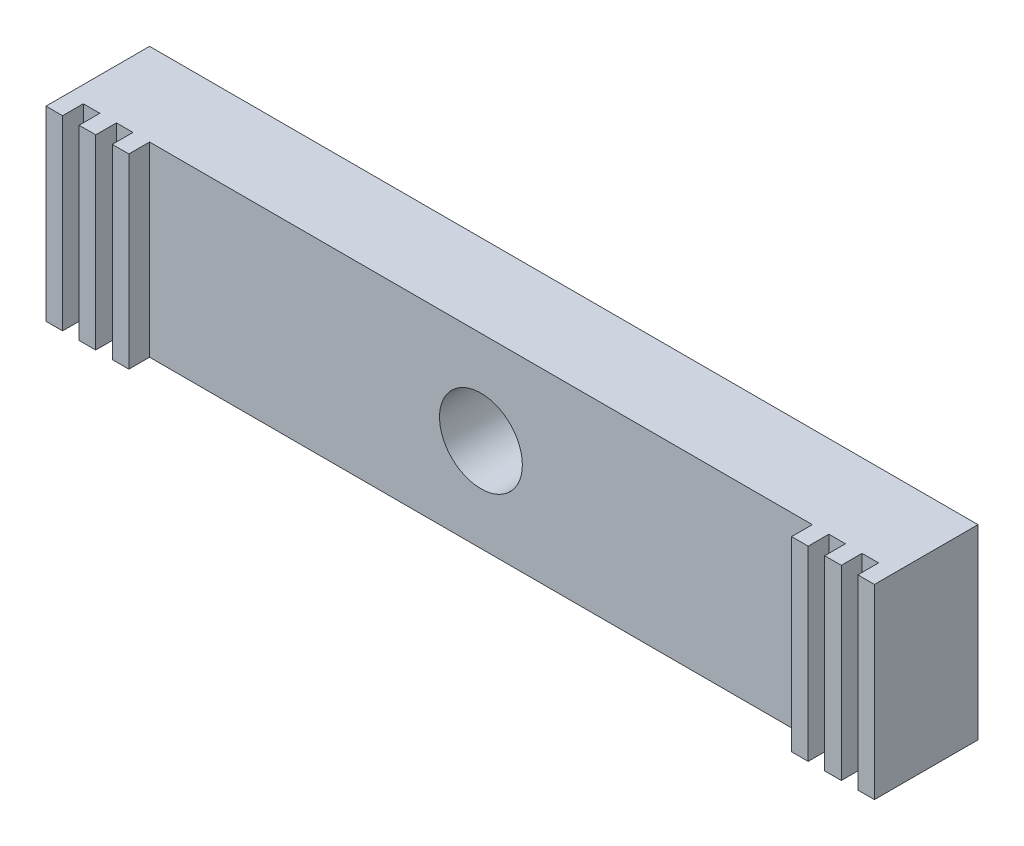
ISO-10303-21;
HEADER;
FILE_DESCRIPTION(('STEP AP214'),'2;1');
FILE_NAME('part.step','',(''),(''),'','','');
FILE_SCHEMA(('AUTOMOTIVE_DESIGN { 1 0 10303 214 1 1 1 1 }'));
ENDSEC;
DATA;
#1=APPLICATION_CONTEXT('core data for automotive mechanical design processes');
#2=APPLICATION_PROTOCOL_DEFINITION('international standard','automotive_design',2000,#1);
#3=PRODUCT_CONTEXT('',#1,'mechanical');
#4=PRODUCT('Part','Part','',(#3));
#5=PRODUCT_RELATED_PRODUCT_CATEGORY('part','',(#4));
#6=PRODUCT_DEFINITION_FORMATION('','',#4);
#7=PRODUCT_DEFINITION_CONTEXT('part definition',#1,'design');
#8=PRODUCT_DEFINITION('design','',#6,#7);
#9=PRODUCT_DEFINITION_SHAPE('','',#8);
#10=(LENGTH_UNIT() NAMED_UNIT(*) SI_UNIT(.MILLI.,.METRE.));
#11=(NAMED_UNIT(*) PLANE_ANGLE_UNIT() SI_UNIT($,.RADIAN.));
#12=(NAMED_UNIT(*) SI_UNIT($,.STERADIAN.) SOLID_ANGLE_UNIT());
#13=UNCERTAINTY_MEASURE_WITH_UNIT(LENGTH_MEASURE(1.E-05),#10,'distance_accuracy_value','');
#14=(GEOMETRIC_REPRESENTATION_CONTEXT(3) GLOBAL_UNCERTAINTY_ASSIGNED_CONTEXT((#13)) GLOBAL_UNIT_ASSIGNED_CONTEXT((#10,
#11,#12)) REPRESENTATION_CONTEXT('',''));
#15=CARTESIAN_POINT('',(0.,0.,0.));
#16=DIRECTION('',(0.,0.,1.));
#17=DIRECTION('',(1.,0.,0.));
#18=AXIS2_PLACEMENT_3D('',#15,#16,#17);
#19=CARTESIAN_POINT('',(0.,0.,4.));
#20=DIRECTION('',(0.,0.,1.));
#21=DIRECTION('',(1.,0.,0.));
#22=AXIS2_PLACEMENT_3D('',#19,#20,#21);
#23=PLANE('',#22);
#24=DIRECTION('',(1.,0.,0.));
#25=VECTOR('',#24,1.);
#26=CARTESIAN_POINT('',(-20.,-4.5,4.));
#27=LINE('',#26,#25);
#28=CARTESIAN_POINT('',(18.4,-4.5,4.));
#29=VERTEX_POINT('',#28);
#30=CARTESIAN_POINT('',(19.2,-4.5,4.));
#31=VERTEX_POINT('',#30);
#32=EDGE_CURVE('E54',#29,#31,#27,.T.);
#33=ORIENTED_EDGE('',*,*,#32,.T.);
#34=DIRECTION('',(0.,-1.,0.));
#35=VECTOR('',#34,1.);
#36=CARTESIAN_POINT('',(19.2,4.5,4.));
#37=LINE('',#36,#35);
#38=CARTESIAN_POINT('',(19.2,4.5,4.));
#39=VERTEX_POINT('',#38);
#40=EDGE_CURVE('E211',#39,#31,#37,.T.);
#41=ORIENTED_EDGE('',*,*,#40,.F.);
#42=DIRECTION('',(-1.,0.,0.));
#43=VECTOR('',#42,1.);
#44=CARTESIAN_POINT('',(-20.,4.5,4.));
#45=LINE('',#44,#43);
#46=CARTESIAN_POINT('',(18.4,4.5,4.));
#47=VERTEX_POINT('',#46);
#48=EDGE_CURVE('E199',#39,#47,#45,.T.);
#49=ORIENTED_EDGE('',*,*,#48,.T.);
#50=DIRECTION('',(0.,1.,0.));
#51=VECTOR('',#50,1.);
#52=CARTESIAN_POINT('',(18.4,4.5,4.));
#53=LINE('',#52,#51);
#54=EDGE_CURVE('E59',#29,#47,#53,.T.);
#55=ORIENTED_EDGE('',*,*,#54,.F.);
#56=EDGE_LOOP('',(#33,#41,#49,#55));
#57=FACE_BOUND('',#56,.T.);
#58=ADVANCED_FACE('F39',(#57),#23,.T.);
#59=CARTESIAN_POINT('',(16.8,-4.5,4.));
#60=VERTEX_POINT('',#59);
#61=CARTESIAN_POINT('',(17.6,-4.5,4.));
#62=VERTEX_POINT('',#61);
#63=EDGE_CURVE('E426',#60,#62,#27,.T.);
#64=ORIENTED_EDGE('',*,*,#63,.T.);
#65=DIRECTION('',(0.,-1.,0.));
#66=VECTOR('',#65,1.);
#67=CARTESIAN_POINT('',(17.6,4.5,4.));
#68=LINE('',#67,#66);
#69=CARTESIAN_POINT('',(17.6,4.5,4.));
#70=VERTEX_POINT('',#69);
#71=EDGE_CURVE('E244',#70,#62,#68,.T.);
#72=ORIENTED_EDGE('',*,*,#71,.F.);
#73=CARTESIAN_POINT('',(16.8,4.5,4.));
#74=VERTEX_POINT('',#73);
#75=EDGE_CURVE('E208',#70,#74,#45,.T.);
#76=ORIENTED_EDGE('',*,*,#75,.T.);
#77=DIRECTION('',(0.,1.,0.));
#78=VECTOR('',#77,1.);
#79=CARTESIAN_POINT('',(16.8,4.5,4.));
#80=LINE('',#79,#78);
#81=EDGE_CURVE('E268',#60,#74,#80,.T.);
#82=ORIENTED_EDGE('',*,*,#81,.F.);
#83=EDGE_LOOP('',(#64,#72,#76,#82));
#84=FACE_BOUND('',#83,.T.);
#85=ADVANCED_FACE('F433',(#84),#23,.T.);
#86=CARTESIAN_POINT('',(0.,0.,4.));
#87=DIRECTION('',(0.,0.,1.));
#88=DIRECTION('',(1.,0.,0.));
#89=AXIS2_PLACEMENT_3D('',#86,#87,#88);
#90=CIRCLE('',#89,2.);
#91=CARTESIAN_POINT('',(2.,0.,4.));
#92=VERTEX_POINT('',#91);
#93=EDGE_CURVE('E356',#92,#92,#90,.T.);
#94=ORIENTED_EDGE('',*,*,#93,.F.);
#95=EDGE_LOOP('',(#94));
#96=FACE_BOUND('',#95,.T.);
#97=CARTESIAN_POINT('',(-16.,-4.5,4.));
#98=VERTEX_POINT('',#97);
#99=CARTESIAN_POINT('',(16.,-4.5,4.));
#100=VERTEX_POINT('',#99);
#101=EDGE_CURVE('E425',#98,#100,#27,.T.);
#102=ORIENTED_EDGE('',*,*,#101,.T.);
#103=DIRECTION('',(0.,-1.,0.));
#104=VECTOR('',#103,1.);
#105=CARTESIAN_POINT('',(16.,4.5,4.));
#106=LINE('',#105,#104);
#107=CARTESIAN_POINT('',(16.,4.5,4.));
#108=VERTEX_POINT('',#107);
#109=EDGE_CURVE('E271',#108,#100,#106,.T.);
#110=ORIENTED_EDGE('',*,*,#109,.F.);
#111=CARTESIAN_POINT('',(-16.,4.5,4.));
#112=VERTEX_POINT('',#111);
#113=EDGE_CURVE('E446',#108,#112,#45,.T.);
#114=ORIENTED_EDGE('',*,*,#113,.T.);
#115=DIRECTION('',(0.,1.,0.));
#116=VECTOR('',#115,1.);
#117=CARTESIAN_POINT('',(-16.,4.5,4.));
#118=LINE('',#117,#116);
#119=EDGE_CURVE('E295',#98,#112,#118,.T.);
#120=ORIENTED_EDGE('',*,*,#119,.F.);
#121=EDGE_LOOP('',(#102,#110,#114,#120));
#122=FACE_BOUND('',#121,.T.);
#123=ADVANCED_FACE('F447',(#96,#122),#23,.T.);
#124=CARTESIAN_POINT('',(-17.6,-4.5,4.));
#125=VERTEX_POINT('',#124);
#126=CARTESIAN_POINT('',(-16.8,-4.5,4.));
#127=VERTEX_POINT('',#126);
#128=EDGE_CURVE('E363',#125,#127,#27,.T.);
#129=ORIENTED_EDGE('',*,*,#128,.T.);
#130=DIRECTION('',(0.,-1.,0.));
#131=VECTOR('',#130,1.);
#132=CARTESIAN_POINT('',(-16.8,4.5,4.));
#133=LINE('',#132,#131);
#134=CARTESIAN_POINT('',(-16.8,4.5,4.));
#135=VERTEX_POINT('',#134);
#136=EDGE_CURVE('E298',#135,#127,#133,.T.);
#137=ORIENTED_EDGE('',*,*,#136,.F.);
#138=CARTESIAN_POINT('',(-17.6,4.5,4.));
#139=VERTEX_POINT('',#138);
#140=EDGE_CURVE('E422',#135,#139,#45,.T.);
#141=ORIENTED_EDGE('',*,*,#140,.T.);
#142=DIRECTION('',(0.,1.,0.));
#143=VECTOR('',#142,1.);
#144=CARTESIAN_POINT('',(-17.6,4.5,4.));
#145=LINE('',#144,#143);
#146=EDGE_CURVE('E322',#125,#139,#145,.T.);
#147=ORIENTED_EDGE('',*,*,#146,.F.);
#148=EDGE_LOOP('',(#129,#137,#141,#147));
#149=FACE_BOUND('',#148,.T.);
#150=ADVANCED_FACE('F420',(#149),#23,.T.);
#151=CARTESIAN_POINT('',(-19.2,-4.5,4.));
#152=VERTEX_POINT('',#151);
#153=CARTESIAN_POINT('',(-18.4,-4.5,4.));
#154=VERTEX_POINT('',#153);
#155=EDGE_CURVE('E362',#152,#154,#27,.T.);
#156=ORIENTED_EDGE('',*,*,#155,.T.);
#157=DIRECTION('',(0.,-1.,0.));
#158=VECTOR('',#157,1.);
#159=CARTESIAN_POINT('',(-18.4,4.5,4.));
#160=LINE('',#159,#158);
#161=CARTESIAN_POINT('',(-18.4,4.5,4.));
#162=VERTEX_POINT('',#161);
#163=EDGE_CURVE('E325',#162,#154,#160,.T.);
#164=ORIENTED_EDGE('',*,*,#163,.F.);
#165=CARTESIAN_POINT('',(-19.2,4.5,4.));
#166=VERTEX_POINT('',#165);
#167=EDGE_CURVE('E210',#162,#166,#45,.T.);
#168=ORIENTED_EDGE('',*,*,#167,.T.);
#169=DIRECTION('',(0.,1.,0.));
#170=VECTOR('',#169,1.);
#171=CARTESIAN_POINT('',(-19.2,4.5,4.));
#172=LINE('',#171,#170);
#173=EDGE_CURVE('E329',#152,#166,#172,.T.);
#174=ORIENTED_EDGE('',*,*,#173,.F.);
#175=EDGE_LOOP('',(#156,#164,#168,#174));
#176=FACE_BOUND('',#175,.T.);
#177=ADVANCED_FACE('F404',(#176),#23,.T.);
#178=CARTESIAN_POINT('',(0.,0.,0.));
#179=DIRECTION('',(0.,0.,1.));
#180=DIRECTION('',(1.,0.,0.));
#181=AXIS2_PLACEMENT_3D('',#178,#179,#180);
#182=PLANE('',#181);
#183=DIRECTION('',(0.,-1.,0.));
#184=VECTOR('',#183,1.);
#185=CARTESIAN_POINT('',(-20.,4.5,0.));
#186=LINE('',#185,#184);
#187=CARTESIAN_POINT('',(-20.,4.5,0.));
#188=VERTEX_POINT('',#187);
#189=CARTESIAN_POINT('',(-20.,-4.5,0.));
#190=VERTEX_POINT('',#189);
#191=EDGE_CURVE('E359',#188,#190,#186,.T.);
#192=ORIENTED_EDGE('',*,*,#191,.F.);
#193=DIRECTION('',(-1.,0.,0.));
#194=VECTOR('',#193,1.);
#195=CARTESIAN_POINT('',(-20.,4.5,0.));
#196=LINE('',#195,#194);
#197=CARTESIAN_POINT('',(20.,4.5,0.));
#198=VERTEX_POINT('',#197);
#199=EDGE_CURVE('E371',#198,#188,#196,.T.);
#200=ORIENTED_EDGE('',*,*,#199,.F.);
#201=DIRECTION('',(0.,1.,0.));
#202=VECTOR('',#201,1.);
#203=CARTESIAN_POINT('',(20.,4.5,0.));
#204=LINE('',#203,#202);
#205=CARTESIAN_POINT('',(20.,-4.5,0.));
#206=VERTEX_POINT('',#205);
#207=EDGE_CURVE('E369',#206,#198,#204,.T.);
#208=ORIENTED_EDGE('',*,*,#207,.F.);
#209=DIRECTION('',(1.,0.,0.));
#210=VECTOR('',#209,1.);
#211=CARTESIAN_POINT('',(-20.,-4.5,0.));
#212=LINE('',#211,#210);
#213=EDGE_CURVE('E367',#190,#206,#212,.T.);
#214=ORIENTED_EDGE('',*,*,#213,.F.);
#215=EDGE_LOOP('',(#192,#200,#208,#214));
#216=FACE_BOUND('',#215,.T.);
#217=CARTESIAN_POINT('',(0.,0.,0.));
#218=DIRECTION('',(0.,0.,1.));
#219=DIRECTION('',(1.,0.,0.));
#220=AXIS2_PLACEMENT_3D('',#217,#218,#219);
#221=CIRCLE('',#220,2.);
#222=CARTESIAN_POINT('',(2.,0.,0.));
#223=VERTEX_POINT('',#222);
#224=EDGE_CURVE('E355',#223,#223,#221,.T.);
#225=ORIENTED_EDGE('',*,*,#224,.T.);
#226=EDGE_LOOP('',(#225));
#227=FACE_BOUND('',#226,.T.);
#228=ADVANCED_FACE('F387',(#216,#227),#182,.F.);
#229=CARTESIAN_POINT('',(-20.,4.5,4.));
#230=DIRECTION('',(1.,0.,0.));
#231=DIRECTION('',(0.,0.,-1.));
#232=AXIS2_PLACEMENT_3D('',#229,#230,#231);
#233=PLANE('',#232);
#234=ORIENTED_EDGE('',*,*,#191,.T.);
#235=DIRECTION('',(0.,0.,-1.));
#236=VECTOR('',#235,1.);
#237=CARTESIAN_POINT('',(-20.,-4.5,4.));
#238=LINE('',#237,#236);
#239=CARTESIAN_POINT('',(-20.,-4.5,5.));
#240=VERTEX_POINT('',#239);
#241=EDGE_CURVE('E11',#240,#190,#238,.T.);
#242=ORIENTED_EDGE('',*,*,#241,.F.);
#243=DIRECTION('',(0.,-1.,0.));
#244=VECTOR('',#243,1.);
#245=CARTESIAN_POINT('',(-20.,4.5,5.));
#246=LINE('',#245,#244);
#247=CARTESIAN_POINT('',(-20.,4.5,5.));
#248=VERTEX_POINT('',#247);
#249=EDGE_CURVE('E340',#248,#240,#246,.T.);
#250=ORIENTED_EDGE('',*,*,#249,.F.);
#251=DIRECTION('',(0.,0.,-1.));
#252=VECTOR('',#251,1.);
#253=CARTESIAN_POINT('',(-20.,4.5,4.));
#254=LINE('',#253,#252);
#255=EDGE_CURVE('E207',#248,#188,#254,.T.);
#256=ORIENTED_EDGE('',*,*,#255,.T.);
#257=EDGE_LOOP('',(#234,#242,#250,#256));
#258=FACE_BOUND('',#257,.T.);
#259=ADVANCED_FACE('F41',(#258),#233,.F.);
#260=CARTESIAN_POINT('',(-20.,-4.5,4.));
#261=DIRECTION('',(0.,1.,0.));
#262=DIRECTION('',(0.,0.,1.));
#263=AXIS2_PLACEMENT_3D('',#260,#261,#262);
#264=PLANE('',#263);
#265=ORIENTED_EDGE('',*,*,#213,.T.);
#266=DIRECTION('',(0.,0.,-1.));
#267=VECTOR('',#266,1.);
#268=CARTESIAN_POINT('',(20.,-4.5,4.));
#269=LINE('',#268,#267);
#270=CARTESIAN_POINT('',(20.,-4.5,5.));
#271=VERTEX_POINT('',#270);
#272=EDGE_CURVE('E47',#271,#206,#269,.T.);
#273=ORIENTED_EDGE('',*,*,#272,.F.);
#274=DIRECTION('',(1.,0.,0.));
#275=VECTOR('',#274,1.);
#276=CARTESIAN_POINT('',(19.2,-4.5,5.));
#277=LINE('',#276,#275);
#278=CARTESIAN_POINT('',(19.2,-4.5,5.));
#279=VERTEX_POINT('',#278);
#280=EDGE_CURVE('E228',#279,#271,#277,.T.);
#281=ORIENTED_EDGE('',*,*,#280,.F.);
#282=DIRECTION('',(0.,0.,-1.));
#283=VECTOR('',#282,1.);
#284=CARTESIAN_POINT('',(19.2,-4.5,5.));
#285=LINE('',#284,#283);
#286=EDGE_CURVE('E221',#279,#31,#285,.T.);
#287=ORIENTED_EDGE('',*,*,#286,.T.);
#288=ORIENTED_EDGE('',*,*,#32,.F.);
#289=DIRECTION('',(0.,0.,-1.));
#290=VECTOR('',#289,1.);
#291=CARTESIAN_POINT('',(18.4,-4.5,5.));
#292=LINE('',#291,#290);
#293=CARTESIAN_POINT('',(18.4,-4.5,5.));
#294=VERTEX_POINT('',#293);
#295=EDGE_CURVE('E238',#294,#29,#292,.T.);
#296=ORIENTED_EDGE('',*,*,#295,.F.);
#297=DIRECTION('',(1.,0.,0.));
#298=VECTOR('',#297,1.);
#299=CARTESIAN_POINT('',(17.6,-4.5,5.));
#300=LINE('',#299,#298);
#301=CARTESIAN_POINT('',(17.6,-4.5,5.));
#302=VERTEX_POINT('',#301);
#303=EDGE_CURVE('E250',#302,#294,#300,.T.);
#304=ORIENTED_EDGE('',*,*,#303,.F.);
#305=DIRECTION('',(0.,0.,-1.));
#306=VECTOR('',#305,1.);
#307=CARTESIAN_POINT('',(17.6,-4.5,5.));
#308=LINE('',#307,#306);
#309=EDGE_CURVE('E235',#302,#62,#308,.T.);
#310=ORIENTED_EDGE('',*,*,#309,.T.);
#311=ORIENTED_EDGE('',*,*,#63,.F.);
#312=DIRECTION('',(0.,0.,-1.));
#313=VECTOR('',#312,1.);
#314=CARTESIAN_POINT('',(16.8,-4.5,5.));
#315=LINE('',#314,#313);
#316=CARTESIAN_POINT('',(16.8,-4.5,5.));
#317=VERTEX_POINT('',#316);
#318=EDGE_CURVE('E261',#317,#60,#315,.T.);
#319=ORIENTED_EDGE('',*,*,#318,.F.);
#320=DIRECTION('',(1.,0.,0.));
#321=VECTOR('',#320,1.);
#322=CARTESIAN_POINT('',(16.,-4.5,5.));
#323=LINE('',#322,#321);
#324=CARTESIAN_POINT('',(16.,-4.5,5.));
#325=VERTEX_POINT('',#324);
#326=EDGE_CURVE('E277',#325,#317,#323,.T.);
#327=ORIENTED_EDGE('',*,*,#326,.F.);
#328=DIRECTION('',(0.,0.,-1.));
#329=VECTOR('',#328,1.);
#330=CARTESIAN_POINT('',(16.,-4.5,5.));
#331=LINE('',#330,#329);
#332=EDGE_CURVE('E258',#325,#100,#331,.T.);
#333=ORIENTED_EDGE('',*,*,#332,.T.);
#334=ORIENTED_EDGE('',*,*,#101,.F.);
#335=DIRECTION('',(0.,0.,-1.));
#336=VECTOR('',#335,1.);
#337=CARTESIAN_POINT('',(-16.,-4.5,5.));
#338=LINE('',#337,#336);
#339=CARTESIAN_POINT('',(-16.,-4.5,5.));
#340=VERTEX_POINT('',#339);
#341=EDGE_CURVE('E288',#340,#98,#338,.T.);
#342=ORIENTED_EDGE('',*,*,#341,.F.);
#343=DIRECTION('',(1.,0.,0.));
#344=VECTOR('',#343,1.);
#345=CARTESIAN_POINT('',(-16.8,-4.5,5.));
#346=LINE('',#345,#344);
#347=CARTESIAN_POINT('',(-16.8,-4.5,5.));
#348=VERTEX_POINT('',#347);
#349=EDGE_CURVE('E304',#348,#340,#346,.T.);
#350=ORIENTED_EDGE('',*,*,#349,.F.);
#351=DIRECTION('',(0.,0.,-1.));
#352=VECTOR('',#351,1.);
#353=CARTESIAN_POINT('',(-16.8,-4.5,5.));
#354=LINE('',#353,#352);
#355=EDGE_CURVE('E285',#348,#127,#354,.T.);
#356=ORIENTED_EDGE('',*,*,#355,.T.);
#357=ORIENTED_EDGE('',*,*,#128,.F.);
#358=DIRECTION('',(0.,0.,-1.));
#359=VECTOR('',#358,1.);
#360=CARTESIAN_POINT('',(-17.6,-4.5,5.));
#361=LINE('',#360,#359);
#362=CARTESIAN_POINT('',(-17.6,-4.5,5.));
#363=VERTEX_POINT('',#362);
#364=EDGE_CURVE('E315',#363,#125,#361,.T.);
#365=ORIENTED_EDGE('',*,*,#364,.F.);
#366=DIRECTION('',(1.,0.,0.));
#367=VECTOR('',#366,1.);
#368=CARTESIAN_POINT('',(-18.4,-4.5,5.));
#369=LINE('',#368,#367);
#370=CARTESIAN_POINT('',(-18.4,-4.5,5.));
#371=VERTEX_POINT('',#370);
#372=EDGE_CURVE('E331',#371,#363,#369,.T.);
#373=ORIENTED_EDGE('',*,*,#372,.F.);
#374=DIRECTION('',(0.,0.,-1.));
#375=VECTOR('',#374,1.);
#376=CARTESIAN_POINT('',(-18.4,-4.5,5.));
#377=LINE('',#376,#375);
#378=EDGE_CURVE('E312',#371,#154,#377,.T.);
#379=ORIENTED_EDGE('',*,*,#378,.T.);
#380=ORIENTED_EDGE('',*,*,#155,.F.);
#381=DIRECTION('',(0.,0.,-1.));
#382=VECTOR('',#381,1.);
#383=CARTESIAN_POINT('',(-19.2,-4.5,5.));
#384=LINE('',#383,#382);
#385=CARTESIAN_POINT('',(-19.2,-4.5,5.));
#386=VERTEX_POINT('',#385);
#387=EDGE_CURVE('E352',#386,#152,#384,.T.);
#388=ORIENTED_EDGE('',*,*,#387,.F.);
#389=DIRECTION('',(1.,0.,0.));
#390=VECTOR('',#389,1.);
#391=CARTESIAN_POINT('',(-20.,-4.5,5.));
#392=LINE('',#391,#390);
#393=EDGE_CURVE('E343',#240,#386,#392,.T.);
#394=ORIENTED_EDGE('',*,*,#393,.F.);
#395=ORIENTED_EDGE('',*,*,#241,.T.);
#396=EDGE_LOOP('',(#265,#273,#281,#287,#288,#296,#304,#310,#311,#319,#327,#333,#334,#342,#350,
#356,#357,#365,#373,#379,#380,#388,#394,#395));
#397=FACE_BOUND('',#396,.T.);
#398=ADVANCED_FACE('F405',(#397),#264,.F.);
#399=CARTESIAN_POINT('',(20.,4.5,4.));
#400=DIRECTION('',(-1.,0.,0.));
#401=DIRECTION('',(0.,0.,1.));
#402=AXIS2_PLACEMENT_3D('',#399,#400,#401);
#403=PLANE('',#402);
#404=ORIENTED_EDGE('',*,*,#207,.T.);
#405=DIRECTION('',(0.,0.,-1.));
#406=VECTOR('',#405,1.);
#407=CARTESIAN_POINT('',(20.,4.5,4.));
#408=LINE('',#407,#406);
#409=CARTESIAN_POINT('',(20.,4.5,5.));
#410=VERTEX_POINT('',#409);
#411=EDGE_CURVE('E375',#410,#198,#408,.T.);
#412=ORIENTED_EDGE('',*,*,#411,.F.);
#413=DIRECTION('',(0.,1.,0.));
#414=VECTOR('',#413,1.);
#415=CARTESIAN_POINT('',(20.,4.5,5.));
#416=LINE('',#415,#414);
#417=EDGE_CURVE('E223',#271,#410,#416,.T.);
#418=ORIENTED_EDGE('',*,*,#417,.F.);
#419=ORIENTED_EDGE('',*,*,#272,.T.);
#420=EDGE_LOOP('',(#404,#412,#418,#419));
#421=FACE_BOUND('',#420,.T.);
#422=ADVANCED_FACE('F381',(#421),#403,.F.);
#423=CARTESIAN_POINT('',(-20.,4.5,4.));
#424=DIRECTION('',(0.,-1.,0.));
#425=DIRECTION('',(0.,0.,-1.));
#426=AXIS2_PLACEMENT_3D('',#423,#424,#425);
#427=PLANE('',#426);
#428=ORIENTED_EDGE('',*,*,#199,.T.);
#429=ORIENTED_EDGE('',*,*,#255,.F.);
#430=DIRECTION('',(-1.,0.,0.));
#431=VECTOR('',#430,1.);
#432=CARTESIAN_POINT('',(-19.2,4.5,5.));
#433=LINE('',#432,#431);
#434=CARTESIAN_POINT('',(-19.2,4.5,5.));
#435=VERTEX_POINT('',#434);
#436=EDGE_CURVE('E337',#435,#248,#433,.T.);
#437=ORIENTED_EDGE('',*,*,#436,.F.);
#438=DIRECTION('',(0.,0.,-1.));
#439=VECTOR('',#438,1.);
#440=CARTESIAN_POINT('',(-19.2,4.5,5.));
#441=LINE('',#440,#439);
#442=EDGE_CURVE('E347',#435,#166,#441,.T.);
#443=ORIENTED_EDGE('',*,*,#442,.T.);
#444=ORIENTED_EDGE('',*,*,#167,.F.);
#445=DIRECTION('',(0.,0.,-1.));
#446=VECTOR('',#445,1.);
#447=CARTESIAN_POINT('',(-18.4,4.5,5.));
#448=LINE('',#447,#446);
#449=CARTESIAN_POINT('',(-18.4,4.5,5.));
#450=VERTEX_POINT('',#449);
#451=EDGE_CURVE('E302',#450,#162,#448,.T.);
#452=ORIENTED_EDGE('',*,*,#451,.F.);
#453=DIRECTION('',(-1.,0.,0.));
#454=VECTOR('',#453,1.);
#455=CARTESIAN_POINT('',(-18.4,4.5,5.));
#456=LINE('',#455,#454);
#457=CARTESIAN_POINT('',(-17.6,4.5,5.));
#458=VERTEX_POINT('',#457);
#459=EDGE_CURVE('E326',#458,#450,#456,.T.);
#460=ORIENTED_EDGE('',*,*,#459,.F.);
#461=DIRECTION('',(0.,0.,-1.));
#462=VECTOR('',#461,1.);
#463=CARTESIAN_POINT('',(-17.6,4.5,5.));
#464=LINE('',#463,#462);
#465=EDGE_CURVE('E318',#458,#139,#464,.T.);
#466=ORIENTED_EDGE('',*,*,#465,.T.);
#467=ORIENTED_EDGE('',*,*,#140,.F.);
#468=DIRECTION('',(0.,0.,-1.));
#469=VECTOR('',#468,1.);
#470=CARTESIAN_POINT('',(-16.8,4.5,5.));
#471=LINE('',#470,#469);
#472=CARTESIAN_POINT('',(-16.8,4.5,5.));
#473=VERTEX_POINT('',#472);
#474=EDGE_CURVE('E275',#473,#135,#471,.T.);
#475=ORIENTED_EDGE('',*,*,#474,.F.);
#476=DIRECTION('',(-1.,0.,0.));
#477=VECTOR('',#476,1.);
#478=CARTESIAN_POINT('',(-16.8,4.5,5.));
#479=LINE('',#478,#477);
#480=CARTESIAN_POINT('',(-16.,4.5,5.));
#481=VERTEX_POINT('',#480);
#482=EDGE_CURVE('E299',#481,#473,#479,.T.);
#483=ORIENTED_EDGE('',*,*,#482,.F.);
#484=DIRECTION('',(0.,0.,-1.));
#485=VECTOR('',#484,1.);
#486=CARTESIAN_POINT('',(-16.,4.5,5.));
#487=LINE('',#486,#485);
#488=EDGE_CURVE('E291',#481,#112,#487,.T.);
#489=ORIENTED_EDGE('',*,*,#488,.T.);
#490=ORIENTED_EDGE('',*,*,#113,.F.);
#491=DIRECTION('',(0.,0.,-1.));
#492=VECTOR('',#491,1.);
#493=CARTESIAN_POINT('',(16.,4.5,5.));
#494=LINE('',#493,#492);
#495=CARTESIAN_POINT('',(16.,4.5,5.));
#496=VERTEX_POINT('',#495);
#497=EDGE_CURVE('E248',#496,#108,#494,.T.);
#498=ORIENTED_EDGE('',*,*,#497,.F.);
#499=DIRECTION('',(-1.,0.,0.));
#500=VECTOR('',#499,1.);
#501=CARTESIAN_POINT('',(16.8,4.5,5.));
#502=LINE('',#501,#500);
#503=CARTESIAN_POINT('',(16.8,4.5,5.));
#504=VERTEX_POINT('',#503);
#505=EDGE_CURVE('E272',#504,#496,#502,.T.);
#506=ORIENTED_EDGE('',*,*,#505,.F.);
#507=DIRECTION('',(0.,0.,-1.));
#508=VECTOR('',#507,1.);
#509=CARTESIAN_POINT('',(16.8,4.5,5.));
#510=LINE('',#509,#508);
#511=EDGE_CURVE('E264',#504,#74,#510,.T.);
#512=ORIENTED_EDGE('',*,*,#511,.T.);
#513=ORIENTED_EDGE('',*,*,#75,.F.);
#514=DIRECTION('',(0.,0.,-1.));
#515=VECTOR('',#514,1.);
#516=CARTESIAN_POINT('',(17.6,4.5,5.));
#517=LINE('',#516,#515);
#518=CARTESIAN_POINT('',(17.6,4.5,5.));
#519=VERTEX_POINT('',#518);
#520=EDGE_CURVE('E215',#519,#70,#517,.T.);
#521=ORIENTED_EDGE('',*,*,#520,.F.);
#522=DIRECTION('',(-1.,0.,0.));
#523=VECTOR('',#522,1.);
#524=CARTESIAN_POINT('',(17.6,4.5,5.));
#525=LINE('',#524,#523);
#526=CARTESIAN_POINT('',(18.4,4.5,5.));
#527=VERTEX_POINT('',#526);
#528=EDGE_CURVE('E245',#527,#519,#525,.T.);
#529=ORIENTED_EDGE('',*,*,#528,.F.);
#530=DIRECTION('',(0.,0.,-1.));
#531=VECTOR('',#530,1.);
#532=CARTESIAN_POINT('',(18.4,4.5,5.));
#533=LINE('',#532,#531);
#534=EDGE_CURVE('E206',#527,#47,#533,.T.);
#535=ORIENTED_EDGE('',*,*,#534,.T.);
#536=ORIENTED_EDGE('',*,*,#48,.F.);
#537=DIRECTION('',(0.,0.,-1.));
#538=VECTOR('',#537,1.);
#539=CARTESIAN_POINT('',(19.2,4.5,5.));
#540=LINE('',#539,#538);
#541=CARTESIAN_POINT('',(19.2,4.5,5.));
#542=VERTEX_POINT('',#541);
#543=EDGE_CURVE('E203',#542,#39,#540,.T.);
#544=ORIENTED_EDGE('',*,*,#543,.F.);
#545=DIRECTION('',(-1.,0.,0.));
#546=VECTOR('',#545,1.);
#547=CARTESIAN_POINT('',(19.2,4.5,5.));
#548=LINE('',#547,#546);
#549=EDGE_CURVE('E216',#410,#542,#548,.T.);
#550=ORIENTED_EDGE('',*,*,#549,.F.);
#551=ORIENTED_EDGE('',*,*,#411,.T.);
#552=EDGE_LOOP('',(#428,#429,#437,#443,#444,#452,#460,#466,#467,#475,#483,#489,#490,#498,#506,
#512,#513,#521,#529,#535,#536,#544,#550,#551));
#553=FACE_BOUND('',#552,.T.);
#554=ADVANCED_FACE('F200',(#553),#427,.F.);
#555=CARTESIAN_POINT('',(0.,0.,4.));
#556=DIRECTION('',(0.,0.,-1.));
#557=DIRECTION('',(-1.,0.,0.));
#558=AXIS2_PLACEMENT_3D('',#555,#556,#557);
#559=CYLINDRICAL_SURFACE('',#558,2.);
#560=ORIENTED_EDGE('',*,*,#93,.T.);
#561=EDGE_LOOP('',(#560));
#562=FACE_BOUND('',#561,.T.);
#563=ORIENTED_EDGE('',*,*,#224,.F.);
#564=EDGE_LOOP('',(#563));
#565=FACE_BOUND('',#564,.T.);
#566=ADVANCED_FACE('F497',(#562,#565),#559,.F.);
#567=CARTESIAN_POINT('',(-19.2,4.5,5.));
#568=DIRECTION('',(-1.,0.,0.));
#569=DIRECTION('',(0.,0.,1.));
#570=AXIS2_PLACEMENT_3D('',#567,#568,#569);
#571=PLANE('',#570);
#572=ORIENTED_EDGE('',*,*,#173,.T.);
#573=ORIENTED_EDGE('',*,*,#442,.F.);
#574=DIRECTION('',(0.,1.,0.));
#575=VECTOR('',#574,1.);
#576=CARTESIAN_POINT('',(-19.2,4.5,5.));
#577=LINE('',#576,#575);
#578=EDGE_CURVE('E345',#386,#435,#577,.T.);
#579=ORIENTED_EDGE('',*,*,#578,.F.);
#580=ORIENTED_EDGE('',*,*,#387,.T.);
#581=EDGE_LOOP('',(#572,#573,#579,#580));
#582=FACE_BOUND('',#581,.T.);
#583=ADVANCED_FACE('F400',(#582),#571,.F.);
#584=CARTESIAN_POINT('',(0.,0.,5.));
#585=DIRECTION('',(0.,0.,1.));
#586=DIRECTION('',(1.,0.,0.));
#587=AXIS2_PLACEMENT_3D('',#584,#585,#586);
#588=PLANE('',#587);
#589=ORIENTED_EDGE('',*,*,#436,.T.);
#590=ORIENTED_EDGE('',*,*,#249,.T.);
#591=ORIENTED_EDGE('',*,*,#393,.T.);
#592=ORIENTED_EDGE('',*,*,#578,.T.);
#593=EDGE_LOOP('',(#589,#590,#591,#592));
#594=FACE_BOUND('',#593,.T.);
#595=ADVANCED_FACE('F394',(#594),#588,.T.);
#596=CARTESIAN_POINT('',(-18.4,4.5,5.));
#597=DIRECTION('',(1.,0.,0.));
#598=DIRECTION('',(0.,0.,-1.));
#599=AXIS2_PLACEMENT_3D('',#596,#597,#598);
#600=PLANE('',#599);
#601=ORIENTED_EDGE('',*,*,#163,.T.);
#602=ORIENTED_EDGE('',*,*,#378,.F.);
#603=DIRECTION('',(0.,-1.,0.));
#604=VECTOR('',#603,1.);
#605=CARTESIAN_POINT('',(-18.4,4.5,5.));
#606=LINE('',#605,#604);
#607=EDGE_CURVE('E333',#450,#371,#606,.T.);
#608=ORIENTED_EDGE('',*,*,#607,.F.);
#609=ORIENTED_EDGE('',*,*,#451,.T.);
#610=EDGE_LOOP('',(#601,#602,#608,#609));
#611=FACE_BOUND('',#610,.T.);
#612=ADVANCED_FACE('F410',(#611),#600,.F.);
#613=CARTESIAN_POINT('',(-17.6,4.5,5.));
#614=DIRECTION('',(-1.,0.,0.));
#615=DIRECTION('',(0.,0.,1.));
#616=AXIS2_PLACEMENT_3D('',#613,#614,#615);
#617=PLANE('',#616);
#618=ORIENTED_EDGE('',*,*,#146,.T.);
#619=ORIENTED_EDGE('',*,*,#465,.F.);
#620=DIRECTION('',(0.,1.,0.));
#621=VECTOR('',#620,1.);
#622=CARTESIAN_POINT('',(-17.6,4.5,5.));
#623=LINE('',#622,#621);
#624=EDGE_CURVE('E321',#363,#458,#623,.T.);
#625=ORIENTED_EDGE('',*,*,#624,.F.);
#626=ORIENTED_EDGE('',*,*,#364,.T.);
#627=EDGE_LOOP('',(#618,#619,#625,#626));
#628=FACE_BOUND('',#627,.T.);
#629=ADVANCED_FACE('F417',(#628),#617,.F.);
#630=CARTESIAN_POINT('',(0.,0.,5.));
#631=DIRECTION('',(0.,0.,-1.));
#632=DIRECTION('',(-1.,0.,0.));
#633=AXIS2_PLACEMENT_3D('',#630,#631,#632);
#634=PLANE('',#633);
#635=ORIENTED_EDGE('',*,*,#459,.T.);
#636=ORIENTED_EDGE('',*,*,#607,.T.);
#637=ORIENTED_EDGE('',*,*,#372,.T.);
#638=ORIENTED_EDGE('',*,*,#624,.T.);
#639=EDGE_LOOP('',(#635,#636,#637,#638));
#640=FACE_BOUND('',#639,.T.);
#641=ADVANCED_FACE('F414',(#640),#634,.F.);
#642=CARTESIAN_POINT('',(-16.8,4.5,5.));
#643=DIRECTION('',(1.,0.,0.));
#644=DIRECTION('',(0.,0.,-1.));
#645=AXIS2_PLACEMENT_3D('',#642,#643,#644);
#646=PLANE('',#645);
#647=ORIENTED_EDGE('',*,*,#136,.T.);
#648=ORIENTED_EDGE('',*,*,#355,.F.);
#649=DIRECTION('',(0.,-1.,0.));
#650=VECTOR('',#649,1.);
#651=CARTESIAN_POINT('',(-16.8,4.5,5.));
#652=LINE('',#651,#650);
#653=EDGE_CURVE('E306',#473,#348,#652,.T.);
#654=ORIENTED_EDGE('',*,*,#653,.F.);
#655=ORIENTED_EDGE('',*,*,#474,.T.);
#656=EDGE_LOOP('',(#647,#648,#654,#655));
#657=FACE_BOUND('',#656,.T.);
#658=ADVANCED_FACE('F511',(#657),#646,.F.);
#659=CARTESIAN_POINT('',(-16.,4.5,5.));
#660=DIRECTION('',(-1.,0.,0.));
#661=DIRECTION('',(0.,0.,1.));
#662=AXIS2_PLACEMENT_3D('',#659,#660,#661);
#663=PLANE('',#662);
#664=ORIENTED_EDGE('',*,*,#119,.T.);
#665=ORIENTED_EDGE('',*,*,#488,.F.);
#666=DIRECTION('',(0.,1.,0.));
#667=VECTOR('',#666,1.);
#668=CARTESIAN_POINT('',(-16.,4.5,5.));
#669=LINE('',#668,#667);
#670=EDGE_CURVE('E294',#340,#481,#669,.T.);
#671=ORIENTED_EDGE('',*,*,#670,.F.);
#672=ORIENTED_EDGE('',*,*,#341,.T.);
#673=EDGE_LOOP('',(#664,#665,#671,#672));
#674=FACE_BOUND('',#673,.T.);
#675=ADVANCED_FACE('F451',(#674),#663,.F.);
#676=CARTESIAN_POINT('',(0.,0.,5.));
#677=DIRECTION('',(0.,0.,-1.));
#678=DIRECTION('',(-1.,0.,0.));
#679=AXIS2_PLACEMENT_3D('',#676,#677,#678);
#680=PLANE('',#679);
#681=ORIENTED_EDGE('',*,*,#482,.T.);
#682=ORIENTED_EDGE('',*,*,#653,.T.);
#683=ORIENTED_EDGE('',*,*,#349,.T.);
#684=ORIENTED_EDGE('',*,*,#670,.T.);
#685=EDGE_LOOP('',(#681,#682,#683,#684));
#686=FACE_BOUND('',#685,.T.);
#687=ADVANCED_FACE('F457',(#686),#680,.F.);
#688=CARTESIAN_POINT('',(16.,4.5,5.));
#689=DIRECTION('',(1.,0.,0.));
#690=DIRECTION('',(0.,0.,-1.));
#691=AXIS2_PLACEMENT_3D('',#688,#689,#690);
#692=PLANE('',#691);
#693=ORIENTED_EDGE('',*,*,#109,.T.);
#694=ORIENTED_EDGE('',*,*,#332,.F.);
#695=DIRECTION('',(0.,-1.,0.));
#696=VECTOR('',#695,1.);
#697=CARTESIAN_POINT('',(16.,4.5,5.));
#698=LINE('',#697,#696);
#699=EDGE_CURVE('E279',#496,#325,#698,.T.);
#700=ORIENTED_EDGE('',*,*,#699,.F.);
#701=ORIENTED_EDGE('',*,*,#497,.T.);
#702=EDGE_LOOP('',(#693,#694,#700,#701));
#703=FACE_BOUND('',#702,.T.);
#704=ADVANCED_FACE('F461',(#703),#692,.F.);
#705=CARTESIAN_POINT('',(16.8,4.5,5.));
#706=DIRECTION('',(-1.,0.,0.));
#707=DIRECTION('',(0.,0.,1.));
#708=AXIS2_PLACEMENT_3D('',#705,#706,#707);
#709=PLANE('',#708);
#710=ORIENTED_EDGE('',*,*,#81,.T.);
#711=ORIENTED_EDGE('',*,*,#511,.F.);
#712=DIRECTION('',(0.,1.,0.));
#713=VECTOR('',#712,1.);
#714=CARTESIAN_POINT('',(16.8,4.5,5.));
#715=LINE('',#714,#713);
#716=EDGE_CURVE('E267',#317,#504,#715,.T.);
#717=ORIENTED_EDGE('',*,*,#716,.F.);
#718=ORIENTED_EDGE('',*,*,#318,.T.);
#719=EDGE_LOOP('',(#710,#711,#717,#718));
#720=FACE_BOUND('',#719,.T.);
#721=ADVANCED_FACE('F466',(#720),#709,.F.);
#722=CARTESIAN_POINT('',(0.,0.,5.));
#723=DIRECTION('',(0.,0.,1.));
#724=DIRECTION('',(1.,0.,0.));
#725=AXIS2_PLACEMENT_3D('',#722,#723,#724);
#726=PLANE('',#725);
#727=ORIENTED_EDGE('',*,*,#505,.T.);
#728=ORIENTED_EDGE('',*,*,#699,.T.);
#729=ORIENTED_EDGE('',*,*,#326,.T.);
#730=ORIENTED_EDGE('',*,*,#716,.T.);
#731=EDGE_LOOP('',(#727,#728,#729,#730));
#732=FACE_BOUND('',#731,.T.);
#733=ADVANCED_FACE('F463',(#732),#726,.T.);
#734=CARTESIAN_POINT('',(17.6,4.5,5.));
#735=DIRECTION('',(1.,0.,0.));
#736=DIRECTION('',(0.,0.,-1.));
#737=AXIS2_PLACEMENT_3D('',#734,#735,#736);
#738=PLANE('',#737);
#739=ORIENTED_EDGE('',*,*,#71,.T.);
#740=ORIENTED_EDGE('',*,*,#309,.F.);
#741=DIRECTION('',(0.,-1.,0.));
#742=VECTOR('',#741,1.);
#743=CARTESIAN_POINT('',(17.6,4.5,5.));
#744=LINE('',#743,#742);
#745=EDGE_CURVE('E252',#519,#302,#744,.T.);
#746=ORIENTED_EDGE('',*,*,#745,.F.);
#747=ORIENTED_EDGE('',*,*,#520,.T.);
#748=EDGE_LOOP('',(#739,#740,#746,#747));
#749=FACE_BOUND('',#748,.T.);
#750=ADVANCED_FACE('F437',(#749),#738,.F.);
#751=CARTESIAN_POINT('',(18.4,4.5,5.));
#752=DIRECTION('',(-1.,0.,0.));
#753=DIRECTION('',(0.,0.,1.));
#754=AXIS2_PLACEMENT_3D('',#751,#752,#753);
#755=PLANE('',#754);
#756=ORIENTED_EDGE('',*,*,#54,.T.);
#757=ORIENTED_EDGE('',*,*,#534,.F.);
#758=DIRECTION('',(0.,1.,0.));
#759=VECTOR('',#758,1.);
#760=CARTESIAN_POINT('',(18.4,4.5,5.));
#761=LINE('',#760,#759);
#762=EDGE_CURVE('E242',#294,#527,#761,.T.);
#763=ORIENTED_EDGE('',*,*,#762,.F.);
#764=ORIENTED_EDGE('',*,*,#295,.T.);
#765=EDGE_LOOP('',(#756,#757,#763,#764));
#766=FACE_BOUND('',#765,.T.);
#767=ADVANCED_FACE('F561',(#766),#755,.F.);
#768=CARTESIAN_POINT('',(0.,0.,5.));
#769=DIRECTION('',(0.,0.,-1.));
#770=DIRECTION('',(-1.,0.,0.));
#771=AXIS2_PLACEMENT_3D('',#768,#769,#770);
#772=PLANE('',#771);
#773=ORIENTED_EDGE('',*,*,#528,.T.);
#774=ORIENTED_EDGE('',*,*,#745,.T.);
#775=ORIENTED_EDGE('',*,*,#303,.T.);
#776=ORIENTED_EDGE('',*,*,#762,.T.);
#777=EDGE_LOOP('',(#773,#774,#775,#776));
#778=FACE_BOUND('',#777,.T.);
#779=ADVANCED_FACE('F443',(#778),#772,.F.);
#780=CARTESIAN_POINT('',(19.2,4.5,5.));
#781=DIRECTION('',(1.,0.,0.));
#782=DIRECTION('',(0.,0.,-1.));
#783=AXIS2_PLACEMENT_3D('',#780,#781,#782);
#784=PLANE('',#783);
#785=ORIENTED_EDGE('',*,*,#40,.T.);
#786=ORIENTED_EDGE('',*,*,#286,.F.);
#787=DIRECTION('',(0.,-1.,0.));
#788=VECTOR('',#787,1.);
#789=CARTESIAN_POINT('',(19.2,4.5,5.));
#790=LINE('',#789,#788);
#791=EDGE_CURVE('E219',#542,#279,#790,.T.);
#792=ORIENTED_EDGE('',*,*,#791,.F.);
#793=ORIENTED_EDGE('',*,*,#543,.T.);
#794=EDGE_LOOP('',(#785,#786,#792,#793));
#795=FACE_BOUND('',#794,.T.);
#796=ADVANCED_FACE('F218',(#795),#784,.F.);
#797=CARTESIAN_POINT('',(0.,0.,5.));
#798=DIRECTION('',(0.,0.,-1.));
#799=DIRECTION('',(-1.,0.,0.));
#800=AXIS2_PLACEMENT_3D('',#797,#798,#799);
#801=PLANE('',#800);
#802=ORIENTED_EDGE('',*,*,#549,.T.);
#803=ORIENTED_EDGE('',*,*,#791,.T.);
#804=ORIENTED_EDGE('',*,*,#280,.T.);
#805=ORIENTED_EDGE('',*,*,#417,.T.);
#806=EDGE_LOOP('',(#802,#803,#804,#805));
#807=FACE_BOUND('',#806,.T.);
#808=ADVANCED_FACE('F587',(#807),#801,.F.);
#809=CLOSED_SHELL('',(#58,#85,#123,#150,#177,#228,#259,#398,#422,#554,#566,#583,#595,#612,#629,
#641,#658,#675,#687,#704,#721,#733,#750,#767,#779,#796,#808));
#810=MANIFOLD_SOLID_BREP('B2',#809);
#811=ADVANCED_BREP_SHAPE_REPRESENTATION('',(#18,#810),#14);
#812=SHAPE_DEFINITION_REPRESENTATION(#9,#811);
ENDSEC;
END-ISO-10303-21;
